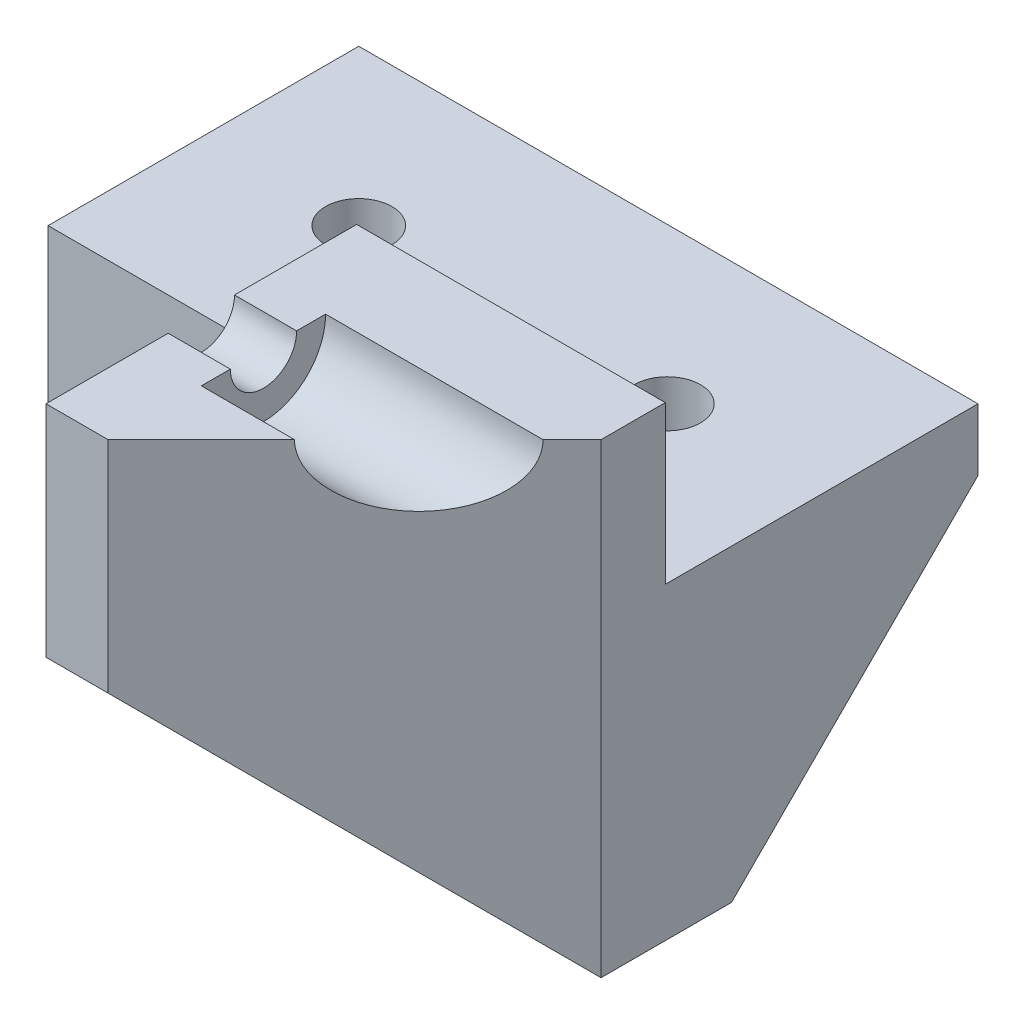
ISO-10303-21;
HEADER;
FILE_DESCRIPTION(('STEP AP214'),'2;1');
FILE_NAME('part.step','',(''),(''),'','','');
FILE_SCHEMA(('AUTOMOTIVE_DESIGN { 1 0 10303 214 1 1 1 1 }'));
ENDSEC;
DATA;
#1=APPLICATION_CONTEXT('core data for automotive mechanical design processes');
#2=APPLICATION_PROTOCOL_DEFINITION('international standard','automotive_design',2000,#1);
#3=PRODUCT_CONTEXT('',#1,'mechanical');
#4=PRODUCT('Part','Part','',(#3));
#5=PRODUCT_RELATED_PRODUCT_CATEGORY('part','',(#4));
#6=PRODUCT_DEFINITION_FORMATION('','',#4);
#7=PRODUCT_DEFINITION_CONTEXT('part definition',#1,'design');
#8=PRODUCT_DEFINITION('design','',#6,#7);
#9=PRODUCT_DEFINITION_SHAPE('','',#8);
#10=(LENGTH_UNIT() NAMED_UNIT(*) SI_UNIT(.MILLI.,.METRE.));
#11=(NAMED_UNIT(*) PLANE_ANGLE_UNIT() SI_UNIT($,.RADIAN.));
#12=(NAMED_UNIT(*) SI_UNIT($,.STERADIAN.) SOLID_ANGLE_UNIT());
#13=UNCERTAINTY_MEASURE_WITH_UNIT(LENGTH_MEASURE(1.E-05),#10,'distance_accuracy_value','');
#14=(GEOMETRIC_REPRESENTATION_CONTEXT(3) GLOBAL_UNCERTAINTY_ASSIGNED_CONTEXT((#13)) GLOBAL_UNIT_ASSIGNED_CONTEXT((#10,
#11,#12)) REPRESENTATION_CONTEXT('',''));
#15=CARTESIAN_POINT('',(0.,0.,0.));
#16=DIRECTION('',(0.,0.,1.));
#17=DIRECTION('',(1.,0.,0.));
#18=AXIS2_PLACEMENT_3D('',#15,#16,#17);
#19=CARTESIAN_POINT('',(29.8,0.,0.));
#20=DIRECTION('',(0.,1.,0.));
#21=DIRECTION('',(0.,0.,1.));
#22=AXIS2_PLACEMENT_3D('',#19,#20,#21);
#23=PLANE('',#22);
#24=DIRECTION('',(0.,0.,-1.));
#25=VECTOR('',#24,1.);
#26=CARTESIAN_POINT('',(6.,0.,0.));
#27=LINE('',#26,#25);
#28=CARTESIAN_POINT('',(6.,0.,11.8));
#29=VERTEX_POINT('',#28);
#30=CARTESIAN_POINT('',(6.,0.,9.00000000000001));
#31=VERTEX_POINT('',#30);
#32=EDGE_CURVE('E165',#29,#31,#27,.T.);
#33=ORIENTED_EDGE('',*,*,#32,.T.);
#34=DIRECTION('',(-1.,0.,0.));
#35=VECTOR('',#34,1.);
#36=CARTESIAN_POINT('',(29.8,0.,9.00000000000001));
#37=LINE('',#36,#35);
#38=CARTESIAN_POINT('',(26.9999999999999,0.,9.00000000000001));
#39=VERTEX_POINT('',#38);
#40=EDGE_CURVE('E162',#39,#31,#37,.T.);
#41=ORIENTED_EDGE('',*,*,#40,.F.);
#42=DIRECTION('',(-0.707106781186544,0.,0.707106781186552));
#43=VECTOR('',#42,1.);
#44=CARTESIAN_POINT('',(18.0000000000001,0.,17.9999999999999));
#45=LINE('',#44,#43);
#46=CARTESIAN_POINT('',(29.8,0.,6.19999999999991));
#47=VERTEX_POINT('',#46);
#48=EDGE_CURVE('E196',#47,#39,#45,.T.);
#49=ORIENTED_EDGE('',*,*,#48,.F.);
#50=DIRECTION('',(0.,0.,-1.));
#51=VECTOR('',#50,1.);
#52=CARTESIAN_POINT('',(29.8,0.,0.));
#53=LINE('',#52,#51);
#54=CARTESIAN_POINT('',(29.8,0.,0.));
#55=VERTEX_POINT('',#54);
#56=EDGE_CURVE('E227',#47,#55,#53,.T.);
#57=ORIENTED_EDGE('',*,*,#56,.T.);
#58=DIRECTION('',(-1.,0.,0.));
#59=VECTOR('',#58,1.);
#60=CARTESIAN_POINT('',(29.8,0.,0.));
#61=LINE('',#60,#59);
#62=CARTESIAN_POINT('',(0.,0.,0.));
#63=VERTEX_POINT('',#62);
#64=EDGE_CURVE('E245',#55,#63,#61,.T.);
#65=ORIENTED_EDGE('',*,*,#64,.T.);
#66=DIRECTION('',(0.,0.,-1.));
#67=VECTOR('',#66,1.);
#68=CARTESIAN_POINT('',(0.,0.,0.));
#69=LINE('',#68,#67);
#70=CARTESIAN_POINT('',(0.,0.,11.8));
#71=VERTEX_POINT('',#70);
#72=EDGE_CURVE('E225',#71,#63,#69,.T.);
#73=ORIENTED_EDGE('',*,*,#72,.F.);
#74=DIRECTION('',(-1.,0.,0.));
#75=VECTOR('',#74,1.);
#76=CARTESIAN_POINT('',(29.8,0.,11.8));
#77=LINE('',#76,#75);
#78=EDGE_CURVE('E63',#29,#71,#77,.T.);
#79=ORIENTED_EDGE('',*,*,#78,.F.);
#80=EDGE_LOOP('',(#33,#41,#49,#57,#65,#73,#79));
#81=FACE_BOUND('',#80,.T.);
#82=ADVANCED_FACE('F55',(#81),#23,.T.);
#83=CARTESIAN_POINT('',(29.8,0.,15.));
#84=DIRECTION('',(-1.,0.,0.));
#85=DIRECTION('',(0.,0.,1.));
#86=AXIS2_PLACEMENT_3D('',#83,#84,#85);
#87=CYLINDRICAL_SURFACE('',#86,3.2);
#88=DIRECTION('',(-1.,0.,0.));
#89=VECTOR('',#88,1.);
#90=CARTESIAN_POINT('',(29.8,0.,18.2));
#91=LINE('',#90,#89);
#92=CARTESIAN_POINT('',(6.,0.,18.2));
#93=VERTEX_POINT('',#92);
#94=CARTESIAN_POINT('',(0.,0.,18.2));
#95=VERTEX_POINT('',#94);
#96=EDGE_CURVE('E281',#93,#95,#91,.T.);
#97=ORIENTED_EDGE('',*,*,#96,.F.);
#98=CARTESIAN_POINT('',(6.,0.,15.));
#99=DIRECTION('',(1.,0.,0.));
#100=DIRECTION('',(0.,0.,-1.));
#101=AXIS2_PLACEMENT_3D('',#98,#99,#100);
#102=CIRCLE('',#101,3.2);
#103=EDGE_CURVE('E171',#93,#29,#102,.T.);
#104=ORIENTED_EDGE('',*,*,#103,.T.);
#105=ORIENTED_EDGE('',*,*,#78,.T.);
#106=CARTESIAN_POINT('',(0.,0.,15.));
#107=DIRECTION('',(1.,0.,0.));
#108=DIRECTION('',(0.,0.,-1.));
#109=AXIS2_PLACEMENT_3D('',#106,#107,#108);
#110=CIRCLE('',#109,3.2);
#111=EDGE_CURVE('E248',#95,#71,#110,.T.);
#112=ORIENTED_EDGE('',*,*,#111,.F.);
#113=EDGE_LOOP('',(#97,#104,#105,#112));
#114=FACE_BOUND('',#113,.T.);
#115=ADVANCED_FACE('F57',(#114),#87,.F.);
#116=CARTESIAN_POINT('',(15.0000000000001,0.,21.));
#117=VERTEX_POINT('',#116);
#118=CARTESIAN_POINT('',(6.00000000000016,0.,30.));
#119=VERTEX_POINT('',#118);
#120=EDGE_CURVE('E178',#117,#119,#45,.T.);
#121=ORIENTED_EDGE('',*,*,#120,.F.);
#122=DIRECTION('',(-1.,0.,0.));
#123=VECTOR('',#122,1.);
#124=CARTESIAN_POINT('',(29.8,0.,21.));
#125=LINE('',#124,#123);
#126=CARTESIAN_POINT('',(6.,0.,21.));
#127=VERTEX_POINT('',#126);
#128=EDGE_CURVE('E69',#117,#127,#125,.T.);
#129=ORIENTED_EDGE('',*,*,#128,.T.);
#130=EDGE_CURVE('E166',#127,#93,#27,.T.);
#131=ORIENTED_EDGE('',*,*,#130,.T.);
#132=ORIENTED_EDGE('',*,*,#96,.T.);
#133=CARTESIAN_POINT('',(0.,0.,30.));
#134=VERTEX_POINT('',#133);
#135=EDGE_CURVE('E249',#134,#95,#69,.T.);
#136=ORIENTED_EDGE('',*,*,#135,.F.);
#137=DIRECTION('',(-1.,0.,0.));
#138=VECTOR('',#137,1.);
#139=CARTESIAN_POINT('',(29.8,0.,30.));
#140=LINE('',#139,#138);
#141=EDGE_CURVE('E279',#119,#134,#140,.T.);
#142=ORIENTED_EDGE('',*,*,#141,.F.);
#143=EDGE_LOOP('',(#121,#129,#131,#132,#136,#142));
#144=FACE_BOUND('',#143,.T.);
#145=ADVANCED_FACE('F176',(#144),#23,.T.);
#146=CARTESIAN_POINT('',(18.0000000000001,-45.,17.9999999999999));
#147=DIRECTION('',(-0.707106781186551,0.,-0.707106781186543));
#148=DIRECTION('',(-0.707106781186544,0.,0.707106781186552));
#149=AXIS2_PLACEMENT_3D('',#146,#147,#148);
#150=PLANE('',#149);
#151=CARTESIAN_POINT('',(21.,0.,15.));
#152=DIRECTION('',(-0.707106781186551,0.,-0.707106781186543));
#153=DIRECTION('',(-0.707106781186544,0.,0.707106781186552));
#154=AXIS2_PLACEMENT_3D('',#151,#152,#153);
#155=ELLIPSE('',#154,8.48528137423852,6.);
#156=EDGE_CURVE('E12',#117,#39,#155,.F.);
#157=ORIENTED_EDGE('',*,*,#156,.F.);
#158=ORIENTED_EDGE('',*,*,#120,.T.);
#159=DIRECTION('',(0.,1.,0.));
#160=VECTOR('',#159,1.);
#161=CARTESIAN_POINT('',(6.00000000000016,-45.,30.));
#162=LINE('',#161,#160);
#163=CARTESIAN_POINT('',(6.00000000000016,-21.2,30.));
#164=VERTEX_POINT('',#163);
#165=EDGE_CURVE('E200',#164,#119,#162,.T.);
#166=ORIENTED_EDGE('',*,*,#165,.F.);
#167=DIRECTION('',(0.577350269189622,-0.577350269189627,-0.577350269189629));
#168=VECTOR('',#167,1.);
#169=CARTESIAN_POINT('',(16.8666666666667,-32.0666666666666,19.1333333333333));
#170=LINE('',#169,#168);
#171=CARTESIAN_POINT('',(29.8,-45.,6.19999999999991));
#172=VERTEX_POINT('',#171);
#173=EDGE_CURVE('E203',#164,#172,#170,.T.);
#174=ORIENTED_EDGE('',*,*,#173,.T.);
#175=DIRECTION('',(0.,1.,0.));
#176=VECTOR('',#175,1.);
#177=CARTESIAN_POINT('',(29.8,-45.,6.19999999999991));
#178=LINE('',#177,#176);
#179=EDGE_CURVE('E199',#172,#47,#178,.T.);
#180=ORIENTED_EDGE('',*,*,#179,.T.);
#181=ORIENTED_EDGE('',*,*,#48,.T.);
#182=EDGE_LOOP('',(#157,#158,#166,#174,#180,#181));
#183=FACE_BOUND('',#182,.T.);
#184=ADVANCED_FACE('F294',(#183),#150,.F.);
#185=CARTESIAN_POINT('',(29.8,0.,30.));
#186=DIRECTION('',(0.,0.,1.));
#187=DIRECTION('',(1.,0.,0.));
#188=AXIS2_PLACEMENT_3D('',#185,#186,#187);
#189=PLANE('',#188);
#190=ORIENTED_EDGE('',*,*,#165,.T.);
#191=ORIENTED_EDGE('',*,*,#141,.T.);
#192=DIRECTION('',(0.,1.,0.));
#193=VECTOR('',#192,1.);
#194=CARTESIAN_POINT('',(0.,0.,30.));
#195=LINE('',#194,#193);
#196=CARTESIAN_POINT('',(0.,-21.2,30.));
#197=VERTEX_POINT('',#196);
#198=EDGE_CURVE('E252',#197,#134,#195,.T.);
#199=ORIENTED_EDGE('',*,*,#198,.F.);
#200=DIRECTION('',(-1.,0.,0.));
#201=VECTOR('',#200,1.);
#202=CARTESIAN_POINT('',(29.8,-21.2,30.));
#203=LINE('',#202,#201);
#204=EDGE_CURVE('E277',#164,#197,#203,.T.);
#205=ORIENTED_EDGE('',*,*,#204,.F.);
#206=EDGE_LOOP('',(#190,#191,#199,#205));
#207=FACE_BOUND('',#206,.T.);
#208=ADVANCED_FACE('F298',(#207),#189,.T.);
#209=CARTESIAN_POINT('',(29.8,-25.6,25.5999999999999));
#210=DIRECTION('',(0.,-0.707106781186549,0.707106781186546));
#211=DIRECTION('',(0.,-0.707106781186546,-0.707106781186549));
#212=AXIS2_PLACEMENT_3D('',#209,#210,#211);
#213=PLANE('',#212);
#214=ORIENTED_EDGE('',*,*,#173,.F.);
#215=ORIENTED_EDGE('',*,*,#204,.T.);
#216=DIRECTION('',(0.,0.707106781186546,0.707106781186549));
#217=VECTOR('',#216,1.);
#218=CARTESIAN_POINT('',(0.,-25.6,25.5999999999999));
#219=LINE('',#218,#217);
#220=CARTESIAN_POINT('',(0.,-45.,6.19999999999991));
#221=VERTEX_POINT('',#220);
#222=EDGE_CURVE('E255',#221,#197,#219,.T.);
#223=ORIENTED_EDGE('',*,*,#222,.F.);
#224=DIRECTION('',(-1.,0.,0.));
#225=VECTOR('',#224,1.);
#226=CARTESIAN_POINT('',(29.8,-45.,6.19999999999991));
#227=LINE('',#226,#225);
#228=EDGE_CURVE('E274',#172,#221,#227,.T.);
#229=ORIENTED_EDGE('',*,*,#228,.F.);
#230=EDGE_LOOP('',(#214,#215,#223,#229));
#231=FACE_BOUND('',#230,.T.);
#232=ADVANCED_FACE('F309',(#231),#213,.T.);
#233=CARTESIAN_POINT('',(29.8,-45.,0.));
#234=DIRECTION('',(0.,-1.,0.));
#235=DIRECTION('',(0.,0.,-1.));
#236=AXIS2_PLACEMENT_3D('',#233,#234,#235);
#237=PLANE('',#236);
#238=DIRECTION('',(0.,0.,1.));
#239=VECTOR('',#238,1.);
#240=CARTESIAN_POINT('',(0.,-45.,0.));
#241=LINE('',#240,#239);
#242=CARTESIAN_POINT('',(0.,-45.,-0.199999999999997));
#243=VERTEX_POINT('',#242);
#244=EDGE_CURVE('E258',#243,#221,#241,.T.);
#245=ORIENTED_EDGE('',*,*,#244,.F.);
#246=DIRECTION('',(1.,0.,0.));
#247=VECTOR('',#246,1.);
#248=CARTESIAN_POINT('',(-30.,-45.,-0.199999999999997));
#249=LINE('',#248,#247);
#250=CARTESIAN_POINT('',(-30.,-45.,-0.199999999999997));
#251=VERTEX_POINT('',#250);
#252=EDGE_CURVE('E77',#251,#243,#249,.T.);
#253=ORIENTED_EDGE('',*,*,#252,.F.);
#254=DIRECTION('',(0.,0.,1.));
#255=VECTOR('',#254,1.);
#256=CARTESIAN_POINT('',(-30.,-45.,0.));
#257=LINE('',#256,#255);
#258=CARTESIAN_POINT('',(-30.,-45.,-6.39999999999993));
#259=VERTEX_POINT('',#258);
#260=EDGE_CURVE('E213',#259,#251,#257,.T.);
#261=ORIENTED_EDGE('',*,*,#260,.F.);
#262=DIRECTION('',(-1.,0.,0.));
#263=VECTOR('',#262,1.);
#264=CARTESIAN_POINT('',(29.8,-45.,-6.39999999999993));
#265=LINE('',#264,#263);
#266=CARTESIAN_POINT('',(29.8,-45.,-6.39999999999993));
#267=VERTEX_POINT('',#266);
#268=EDGE_CURVE('E272',#267,#259,#265,.T.);
#269=ORIENTED_EDGE('',*,*,#268,.F.);
#270=DIRECTION('',(0.,0.,1.));
#271=VECTOR('',#270,1.);
#272=CARTESIAN_POINT('',(29.8,-45.,0.));
#273=LINE('',#272,#271);
#274=EDGE_CURVE('E229',#267,#172,#273,.T.);
#275=ORIENTED_EDGE('',*,*,#274,.T.);
#276=ORIENTED_EDGE('',*,*,#228,.T.);
#277=EDGE_LOOP('',(#245,#253,#261,#269,#275,#276));
#278=FACE_BOUND('',#277,.T.);
#279=ADVANCED_FACE('F341',(#278),#237,.T.);
#280=CARTESIAN_POINT('',(29.8,-25.7,-25.7));
#281=DIRECTION('',(0.,-0.707106781186549,-0.707106781186547));
#282=DIRECTION('',(0.,0.707106781186546,-0.707106781186549));
#283=AXIS2_PLACEMENT_3D('',#280,#281,#282);
#284=PLANE('',#283);
#285=CARTESIAN_POINT('',(14.8,-36.2,-15.2));
#286=DIRECTION('',(0.,-0.707106781186549,-0.707106781186547));
#287=DIRECTION('',(0.,0.707106781186546,-0.707106781186549));
#288=AXIS2_PLACEMENT_3D('',#285,#286,#287);
#289=ELLIPSE('',#288,8.48528137423856,6.);
#290=CARTESIAN_POINT('',(14.8,-30.2,-21.2));
#291=VERTEX_POINT('',#290);
#292=EDGE_CURVE('E289',#291,#291,#289,.T.);
#293=ORIENTED_EDGE('',*,*,#292,.F.);
#294=EDGE_LOOP('',(#293));
#295=FACE_BOUND('',#294,.T.);
#296=CARTESIAN_POINT('',(-15.,-36.2,-15.2));
#297=DIRECTION('',(0.,-0.707106781186549,-0.707106781186547));
#298=DIRECTION('',(0.,0.707106781186546,-0.707106781186549));
#299=AXIS2_PLACEMENT_3D('',#296,#297,#298);
#300=ELLIPSE('',#299,8.48528137423856,6.);
#301=CARTESIAN_POINT('',(-15.,-30.2,-21.2));
#302=VERTEX_POINT('',#301);
#303=EDGE_CURVE('E192',#302,#302,#300,.T.);
#304=ORIENTED_EDGE('',*,*,#303,.F.);
#305=EDGE_LOOP('',(#304));
#306=FACE_BOUND('',#305,.T.);
#307=ORIENTED_EDGE('',*,*,#268,.T.);
#308=DIRECTION('',(0.,-0.707106781186546,0.707106781186549));
#309=VECTOR('',#308,1.);
#310=CARTESIAN_POINT('',(-30.,-25.7,-25.7));
#311=LINE('',#310,#309);
#312=CARTESIAN_POINT('',(-30.,-21.2,-30.2));
#313=VERTEX_POINT('',#312);
#314=EDGE_CURVE('E215',#313,#259,#311,.T.);
#315=ORIENTED_EDGE('',*,*,#314,.F.);
#316=DIRECTION('',(-1.,0.,0.));
#317=VECTOR('',#316,1.);
#318=CARTESIAN_POINT('',(29.8,-21.2,-30.2));
#319=LINE('',#318,#317);
#320=CARTESIAN_POINT('',(29.8,-21.2,-30.2));
#321=VERTEX_POINT('',#320);
#322=EDGE_CURVE('E270',#321,#313,#319,.T.);
#323=ORIENTED_EDGE('',*,*,#322,.F.);
#324=DIRECTION('',(0.,-0.707106781186546,0.707106781186549));
#325=VECTOR('',#324,1.);
#326=CARTESIAN_POINT('',(29.8,-25.7,-25.7));
#327=LINE('',#326,#325);
#328=EDGE_CURVE('E233',#321,#267,#327,.T.);
#329=ORIENTED_EDGE('',*,*,#328,.T.);
#330=EDGE_LOOP('',(#307,#315,#323,#329));
#331=FACE_BOUND('',#330,.T.);
#332=ADVANCED_FACE('F344',(#295,#306,#331),#284,.T.);
#333=CARTESIAN_POINT('',(29.8,0.,-30.2));
#334=DIRECTION('',(0.,0.,-1.));
#335=DIRECTION('',(0.,1.,0.));
#336=AXIS2_PLACEMENT_3D('',#333,#334,#335);
#337=PLANE('',#336);
#338=ORIENTED_EDGE('',*,*,#322,.T.);
#339=DIRECTION('',(0.,-1.,0.));
#340=VECTOR('',#339,1.);
#341=CARTESIAN_POINT('',(-30.,0.,-30.2));
#342=LINE('',#341,#340);
#343=CARTESIAN_POINT('',(-30.,-15.2,-30.2));
#344=VERTEX_POINT('',#343);
#345=EDGE_CURVE('E218',#344,#313,#342,.T.);
#346=ORIENTED_EDGE('',*,*,#345,.F.);
#347=DIRECTION('',(-1.,0.,0.));
#348=VECTOR('',#347,1.);
#349=CARTESIAN_POINT('',(29.8,-15.2,-30.2));
#350=LINE('',#349,#348);
#351=CARTESIAN_POINT('',(29.8,-15.2,-30.2));
#352=VERTEX_POINT('',#351);
#353=EDGE_CURVE('E268',#352,#344,#350,.T.);
#354=ORIENTED_EDGE('',*,*,#353,.F.);
#355=DIRECTION('',(0.,-1.,0.));
#356=VECTOR('',#355,1.);
#357=CARTESIAN_POINT('',(29.8,0.,-30.2));
#358=LINE('',#357,#356);
#359=EDGE_CURVE('E236',#352,#321,#358,.T.);
#360=ORIENTED_EDGE('',*,*,#359,.T.);
#361=EDGE_LOOP('',(#338,#346,#354,#360));
#362=FACE_BOUND('',#361,.T.);
#363=ADVANCED_FACE('F348',(#362),#337,.T.);
#364=CARTESIAN_POINT('',(29.8,-15.2,0.));
#365=DIRECTION('',(0.,1.,0.));
#366=DIRECTION('',(0.,0.,1.));
#367=AXIS2_PLACEMENT_3D('',#364,#365,#366);
#368=PLANE('',#367);
#369=CARTESIAN_POINT('',(14.8,-15.2,-15.2));
#370=DIRECTION('',(0.,1.,0.));
#371=DIRECTION('',(0.,0.,1.));
#372=AXIS2_PLACEMENT_3D('',#369,#370,#371);
#373=CIRCLE('',#372,3.2);
#374=CARTESIAN_POINT('',(14.8,-15.2,-12.));
#375=VERTEX_POINT('',#374);
#376=EDGE_CURVE('E223',#375,#375,#373,.T.);
#377=ORIENTED_EDGE('',*,*,#376,.F.);
#378=EDGE_LOOP('',(#377));
#379=FACE_BOUND('',#378,.T.);
#380=CARTESIAN_POINT('',(-15.,-15.2,-15.2));
#381=DIRECTION('',(0.,1.,0.));
#382=DIRECTION('',(0.,0.,1.));
#383=AXIS2_PLACEMENT_3D('',#380,#381,#382);
#384=CIRCLE('',#383,3.2);
#385=CARTESIAN_POINT('',(-15.,-15.2,-12.));
#386=VERTEX_POINT('',#385);
#387=EDGE_CURVE('E206',#386,#386,#384,.T.);
#388=ORIENTED_EDGE('',*,*,#387,.F.);
#389=EDGE_LOOP('',(#388));
#390=FACE_BOUND('',#389,.T.);
#391=DIRECTION('',(0.,0.,-1.));
#392=VECTOR('',#391,1.);
#393=CARTESIAN_POINT('',(0.,-15.2,0.));
#394=LINE('',#393,#392);
#395=CARTESIAN_POINT('',(0.,-15.2,0.));
#396=VERTEX_POINT('',#395);
#397=CARTESIAN_POINT('',(0.,-15.2,-0.199999999999997));
#398=VERTEX_POINT('',#397);
#399=EDGE_CURVE('E260',#396,#398,#394,.T.);
#400=ORIENTED_EDGE('',*,*,#399,.F.);
#401=DIRECTION('',(-1.,0.,0.));
#402=VECTOR('',#401,1.);
#403=CARTESIAN_POINT('',(29.8,-15.2,0.));
#404=LINE('',#403,#402);
#405=CARTESIAN_POINT('',(29.8,-15.2,0.));
#406=VERTEX_POINT('',#405);
#407=EDGE_CURVE('E266',#406,#396,#404,.T.);
#408=ORIENTED_EDGE('',*,*,#407,.F.);
#409=DIRECTION('',(0.,0.,-1.));
#410=VECTOR('',#409,1.);
#411=CARTESIAN_POINT('',(29.8,-15.2,0.));
#412=LINE('',#411,#410);
#413=EDGE_CURVE('E239',#406,#352,#412,.T.);
#414=ORIENTED_EDGE('',*,*,#413,.T.);
#415=ORIENTED_EDGE('',*,*,#353,.T.);
#416=DIRECTION('',(0.,0.,-1.));
#417=VECTOR('',#416,1.);
#418=CARTESIAN_POINT('',(-30.,-15.2,0.));
#419=LINE('',#418,#417);
#420=CARTESIAN_POINT('',(-30.,-15.2,-0.199999999999997));
#421=VERTEX_POINT('',#420);
#422=EDGE_CURVE('E207',#421,#344,#419,.T.);
#423=ORIENTED_EDGE('',*,*,#422,.F.);
#424=DIRECTION('',(1.,0.,0.));
#425=VECTOR('',#424,1.);
#426=CARTESIAN_POINT('',(-30.,-15.2,-0.199999999999997));
#427=LINE('',#426,#425);
#428=EDGE_CURVE('E221',#421,#398,#427,.T.);
#429=ORIENTED_EDGE('',*,*,#428,.T.);
#430=EDGE_LOOP('',(#400,#408,#414,#415,#423,#429));
#431=FACE_BOUND('',#430,.T.);
#432=ADVANCED_FACE('F352',(#379,#390,#431),#368,.T.);
#433=CARTESIAN_POINT('',(29.8,0.,0.));
#434=DIRECTION('',(0.,0.,-1.));
#435=DIRECTION('',(0.,1.,0.));
#436=AXIS2_PLACEMENT_3D('',#433,#434,#435);
#437=PLANE('',#436);
#438=DIRECTION('',(0.,-1.,0.));
#439=VECTOR('',#438,1.);
#440=CARTESIAN_POINT('',(0.,0.,0.));
#441=LINE('',#440,#439);
#442=EDGE_CURVE('E230',#63,#396,#441,.T.);
#443=ORIENTED_EDGE('',*,*,#442,.F.);
#444=ORIENTED_EDGE('',*,*,#64,.F.);
#445=DIRECTION('',(0.,-1.,0.));
#446=VECTOR('',#445,1.);
#447=CARTESIAN_POINT('',(29.8,0.,0.));
#448=LINE('',#447,#446);
#449=EDGE_CURVE('E242',#55,#406,#448,.T.);
#450=ORIENTED_EDGE('',*,*,#449,.T.);
#451=ORIENTED_EDGE('',*,*,#407,.T.);
#452=EDGE_LOOP('',(#443,#444,#450,#451));
#453=FACE_BOUND('',#452,.T.);
#454=ADVANCED_FACE('F324',(#453),#437,.T.);
#455=CARTESIAN_POINT('',(29.8,0.,0.));
#456=DIRECTION('',(1.,0.,0.));
#457=DIRECTION('',(0.,0.,-1.));
#458=AXIS2_PLACEMENT_3D('',#455,#456,#457);
#459=PLANE('',#458);
#460=ORIENTED_EDGE('',*,*,#179,.F.);
#461=ORIENTED_EDGE('',*,*,#274,.F.);
#462=ORIENTED_EDGE('',*,*,#328,.F.);
#463=ORIENTED_EDGE('',*,*,#359,.F.);
#464=ORIENTED_EDGE('',*,*,#413,.F.);
#465=ORIENTED_EDGE('',*,*,#449,.F.);
#466=ORIENTED_EDGE('',*,*,#56,.F.);
#467=EDGE_LOOP('',(#460,#461,#462,#463,#464,#465,#466));
#468=FACE_BOUND('',#467,.T.);
#469=ADVANCED_FACE('F315',(#468),#459,.T.);
#470=CARTESIAN_POINT('',(0.,0.,0.));
#471=DIRECTION('',(1.,0.,0.));
#472=DIRECTION('',(0.,0.,-1.));
#473=AXIS2_PLACEMENT_3D('',#470,#471,#472);
#474=PLANE('',#473);
#475=ORIENTED_EDGE('',*,*,#399,.T.);
#476=DIRECTION('',(0.,-1.,0.));
#477=VECTOR('',#476,1.);
#478=CARTESIAN_POINT('',(0.,0.,-0.199999999999993));
#479=LINE('',#478,#477);
#480=EDGE_CURVE('E211',#398,#243,#479,.T.);
#481=ORIENTED_EDGE('',*,*,#480,.T.);
#482=ORIENTED_EDGE('',*,*,#244,.T.);
#483=ORIENTED_EDGE('',*,*,#222,.T.);
#484=ORIENTED_EDGE('',*,*,#198,.T.);
#485=ORIENTED_EDGE('',*,*,#135,.T.);
#486=ORIENTED_EDGE('',*,*,#111,.T.);
#487=ORIENTED_EDGE('',*,*,#72,.T.);
#488=ORIENTED_EDGE('',*,*,#442,.T.);
#489=EDGE_LOOP('',(#475,#481,#482,#483,#484,#485,#486,#487,#488));
#490=FACE_BOUND('',#489,.T.);
#491=ADVANCED_FACE('F304',(#490),#474,.F.);
#492=CARTESIAN_POINT('',(-30.,0.,-0.199999999999993));
#493=DIRECTION('',(0.,0.,1.));
#494=DIRECTION('',(0.,-1.,0.));
#495=AXIS2_PLACEMENT_3D('',#492,#493,#494);
#496=PLANE('',#495);
#497=ORIENTED_EDGE('',*,*,#480,.F.);
#498=ORIENTED_EDGE('',*,*,#428,.F.);
#499=DIRECTION('',(0.,-1.,0.));
#500=VECTOR('',#499,1.);
#501=CARTESIAN_POINT('',(-30.,0.,-0.199999999999993));
#502=LINE('',#501,#500);
#503=EDGE_CURVE('E210',#421,#251,#502,.T.);
#504=ORIENTED_EDGE('',*,*,#503,.T.);
#505=ORIENTED_EDGE('',*,*,#252,.T.);
#506=EDGE_LOOP('',(#497,#498,#504,#505));
#507=FACE_BOUND('',#506,.T.);
#508=ADVANCED_FACE('F361',(#507),#496,.T.);
#509=CARTESIAN_POINT('',(-30.,0.,0.));
#510=DIRECTION('',(1.,0.,0.));
#511=DIRECTION('',(0.,0.,-1.));
#512=AXIS2_PLACEMENT_3D('',#509,#510,#511);
#513=PLANE('',#512);
#514=ORIENTED_EDGE('',*,*,#422,.T.);
#515=ORIENTED_EDGE('',*,*,#345,.T.);
#516=ORIENTED_EDGE('',*,*,#314,.T.);
#517=ORIENTED_EDGE('',*,*,#260,.T.);
#518=ORIENTED_EDGE('',*,*,#503,.F.);
#519=EDGE_LOOP('',(#514,#515,#516,#517,#518));
#520=FACE_BOUND('',#519,.T.);
#521=ADVANCED_FACE('F366',(#520),#513,.F.);
#522=CARTESIAN_POINT('',(-15.,-45.,-15.2));
#523=DIRECTION('',(0.,1.,0.));
#524=DIRECTION('',(0.,0.,1.));
#525=AXIS2_PLACEMENT_3D('',#522,#523,#524);
#526=CYLINDRICAL_SURFACE('',#525,3.2);
#527=CARTESIAN_POINT('',(-15.,-21.2,-15.2));
#528=DIRECTION('',(0.,1.,0.));
#529=DIRECTION('',(0.,0.,1.));
#530=AXIS2_PLACEMENT_3D('',#527,#528,#529);
#531=CIRCLE('',#530,3.2);
#532=CARTESIAN_POINT('',(-15.,-21.2,-12.));
#533=VERTEX_POINT('',#532);
#534=EDGE_CURVE('E179',#533,#533,#531,.T.);
#535=CARTESIAN_POINT('',(-15.,-21.2,-12.));
#536=CARTESIAN_POINT('',(-15.,-21.1375,-12.));
#537=CARTESIAN_POINT('',(-15.,-21.075,-12.));
#538=CARTESIAN_POINT('',(-15.,-20.95,-12.));
#539=CARTESIAN_POINT('',(-15.,-20.8875,-12.));
#540=CARTESIAN_POINT('',(-15.,-20.7625,-12.));
#541=CARTESIAN_POINT('',(-15.,-20.7,-12.));
#542=CARTESIAN_POINT('',(-15.,-20.575,-12.));
#543=CARTESIAN_POINT('',(-15.,-20.5125,-12.));
#544=CARTESIAN_POINT('',(-15.,-20.3875,-12.));
#545=CARTESIAN_POINT('',(-15.,-20.325,-12.));
#546=CARTESIAN_POINT('',(-15.,-20.2,-12.));
#547=CARTESIAN_POINT('',(-15.,-20.1375,-12.));
#548=CARTESIAN_POINT('',(-15.,-20.0125,-12.));
#549=CARTESIAN_POINT('',(-15.,-19.95,-12.));
#550=CARTESIAN_POINT('',(-15.,-19.825,-12.));
#551=CARTESIAN_POINT('',(-15.,-19.7625,-12.));
#552=CARTESIAN_POINT('',(-15.,-19.6375,-12.));
#553=CARTESIAN_POINT('',(-15.,-19.575,-12.));
#554=CARTESIAN_POINT('',(-15.,-19.45,-12.));
#555=CARTESIAN_POINT('',(-15.,-19.3875,-12.));
#556=CARTESIAN_POINT('',(-15.,-19.2625,-12.));
#557=CARTESIAN_POINT('',(-15.,-19.2,-12.));
#558=CARTESIAN_POINT('',(-15.,-19.075,-12.));
#559=CARTESIAN_POINT('',(-15.,-19.0125,-12.));
#560=CARTESIAN_POINT('',(-15.,-18.8875,-12.));
#561=CARTESIAN_POINT('',(-15.,-18.825,-12.));
#562=CARTESIAN_POINT('',(-15.,-18.7,-12.));
#563=CARTESIAN_POINT('',(-15.,-18.6375,-12.));
#564=CARTESIAN_POINT('',(-15.,-18.5125,-12.));
#565=CARTESIAN_POINT('',(-15.,-18.45,-12.));
#566=CARTESIAN_POINT('',(-15.,-18.325,-12.));
#567=CARTESIAN_POINT('',(-15.,-18.2625,-12.));
#568=CARTESIAN_POINT('',(-15.,-18.1375,-12.));
#569=CARTESIAN_POINT('',(-15.,-18.075,-12.));
#570=CARTESIAN_POINT('',(-15.,-17.95,-12.));
#571=CARTESIAN_POINT('',(-15.,-17.8875,-12.));
#572=CARTESIAN_POINT('',(-15.,-17.7625,-12.));
#573=CARTESIAN_POINT('',(-15.,-17.7,-12.));
#574=CARTESIAN_POINT('',(-15.,-17.575,-12.));
#575=CARTESIAN_POINT('',(-15.,-17.5125,-12.));
#576=CARTESIAN_POINT('',(-15.,-17.3875,-12.));
#577=CARTESIAN_POINT('',(-15.,-17.325,-12.));
#578=CARTESIAN_POINT('',(-15.,-17.2,-12.));
#579=CARTESIAN_POINT('',(-15.,-17.1375,-12.));
#580=CARTESIAN_POINT('',(-15.,-17.0125,-12.));
#581=CARTESIAN_POINT('',(-15.,-16.95,-12.));
#582=CARTESIAN_POINT('',(-15.,-16.825,-12.));
#583=CARTESIAN_POINT('',(-15.,-16.7625,-12.));
#584=CARTESIAN_POINT('',(-15.,-16.6375,-12.));
#585=CARTESIAN_POINT('',(-15.,-16.575,-12.));
#586=CARTESIAN_POINT('',(-15.,-16.45,-12.));
#587=CARTESIAN_POINT('',(-15.,-16.3875,-12.));
#588=CARTESIAN_POINT('',(-15.,-16.2625,-12.));
#589=CARTESIAN_POINT('',(-15.,-16.2,-12.));
#590=CARTESIAN_POINT('',(-15.,-16.075,-12.));
#591=CARTESIAN_POINT('',(-15.,-16.0125,-12.));
#592=CARTESIAN_POINT('',(-15.,-15.8875,-12.));
#593=CARTESIAN_POINT('',(-15.,-15.825,-12.));
#594=CARTESIAN_POINT('',(-15.,-15.7,-12.));
#595=CARTESIAN_POINT('',(-15.,-15.6375,-12.));
#596=CARTESIAN_POINT('',(-15.,-15.5125,-12.));
#597=CARTESIAN_POINT('',(-15.,-15.45,-12.));
#598=CARTESIAN_POINT('',(-15.,-15.325,-12.));
#599=CARTESIAN_POINT('',(-15.,-15.2625,-12.));
#600=CARTESIAN_POINT('',(-15.,-15.2,-12.));
#601=B_SPLINE_CURVE_WITH_KNOTS('',3,(#535,#536,#537,#538,#539,#540,#541,#542,#543,#544,#545,
#546,#547,#548,#549,#550,#551,#552,#553,#554,#555,#556,#557,#558,#559,#560,#561,#562,#563,#564,
#565,#566,#567,#568,#569,#570,#571,#572,#573,#574,#575,#576,#577,#578,#579,#580,#581,#582,#583,
#584,#585,#586,#587,#588,#589,#590,#591,#592,#593,#594,#595,#596,#597,#598,#599,#600),
.UNSPECIFIED.,.F.,.F.,(4,2,2,2,2,2,2,2,2,2,2,2,2,2,2,2,2,2,2,2,2,2,2,2,2,2,2,2,2,2,2,2,4),(0.,
0.1875,0.375,0.5625,0.750000000000001,0.937500000000001,1.125,1.3125,1.5,1.6875,1.875,2.0625,
2.25,2.4375,2.625,2.8125,3.,3.1875,3.375,3.5625,3.75,3.9375,4.125,4.3125,4.5,4.6875,4.875,
5.0625,5.25,5.4375,5.62500000000001,5.81250000000001,6.00000000000001),.UNSPECIFIED.);
#602=EDGE_CURVE('BSEAM369',#533,#386,#601,.T.);
#603=ORIENTED_EDGE('',*,*,#534,.F.);
#604=ORIENTED_EDGE('',*,*,#387,.T.);
#605=ORIENTED_EDGE('',*,*,#602,.T.);
#606=ORIENTED_EDGE('',*,*,#602,.F.);
#607=EDGE_LOOP('',(#603,#605,#604,#606));
#608=FACE_BOUND('',#607,.T.);
#609=ADVANCED_FACE('F369',(#608),#526,.F.);
#610=CARTESIAN_POINT('',(14.8,-45.,-15.2));
#611=DIRECTION('',(0.,1.,0.));
#612=DIRECTION('',(0.,0.,1.));
#613=AXIS2_PLACEMENT_3D('',#610,#611,#612);
#614=CYLINDRICAL_SURFACE('',#613,3.2);
#615=CARTESIAN_POINT('',(14.8,-21.2,-15.2));
#616=DIRECTION('',(0.,1.,0.));
#617=DIRECTION('',(0.,0.,1.));
#618=AXIS2_PLACEMENT_3D('',#615,#616,#617);
#619=CIRCLE('',#618,3.2);
#620=CARTESIAN_POINT('',(14.8,-21.2,-12.));
#621=VERTEX_POINT('',#620);
#622=EDGE_CURVE('E187',#621,#621,#619,.T.);
#623=CARTESIAN_POINT('',(14.8,-21.2,-12.));
#624=CARTESIAN_POINT('',(14.8,-21.1375,-12.));
#625=CARTESIAN_POINT('',(14.8,-21.075,-12.));
#626=CARTESIAN_POINT('',(14.8,-20.95,-12.));
#627=CARTESIAN_POINT('',(14.8,-20.8875,-12.));
#628=CARTESIAN_POINT('',(14.8,-20.7625,-12.));
#629=CARTESIAN_POINT('',(14.8,-20.7,-12.));
#630=CARTESIAN_POINT('',(14.8,-20.575,-12.));
#631=CARTESIAN_POINT('',(14.8,-20.5125,-12.));
#632=CARTESIAN_POINT('',(14.8,-20.3875,-12.));
#633=CARTESIAN_POINT('',(14.8,-20.325,-12.));
#634=CARTESIAN_POINT('',(14.8,-20.2,-12.));
#635=CARTESIAN_POINT('',(14.8,-20.1375,-12.));
#636=CARTESIAN_POINT('',(14.8,-20.0125,-12.));
#637=CARTESIAN_POINT('',(14.8,-19.95,-12.));
#638=CARTESIAN_POINT('',(14.8,-19.825,-12.));
#639=CARTESIAN_POINT('',(14.8,-19.7625,-12.));
#640=CARTESIAN_POINT('',(14.8,-19.6375,-12.));
#641=CARTESIAN_POINT('',(14.8,-19.575,-12.));
#642=CARTESIAN_POINT('',(14.8,-19.45,-12.));
#643=CARTESIAN_POINT('',(14.8,-19.3875,-12.));
#644=CARTESIAN_POINT('',(14.8,-19.2625,-12.));
#645=CARTESIAN_POINT('',(14.8,-19.2,-12.));
#646=CARTESIAN_POINT('',(14.8,-19.075,-12.));
#647=CARTESIAN_POINT('',(14.8,-19.0125,-12.));
#648=CARTESIAN_POINT('',(14.8,-18.8875,-12.));
#649=CARTESIAN_POINT('',(14.8,-18.825,-12.));
#650=CARTESIAN_POINT('',(14.8,-18.7,-12.));
#651=CARTESIAN_POINT('',(14.8,-18.6375,-12.));
#652=CARTESIAN_POINT('',(14.8,-18.5125,-12.));
#653=CARTESIAN_POINT('',(14.8,-18.45,-12.));
#654=CARTESIAN_POINT('',(14.8,-18.325,-12.));
#655=CARTESIAN_POINT('',(14.8,-18.2625,-12.));
#656=CARTESIAN_POINT('',(14.8,-18.1375,-12.));
#657=CARTESIAN_POINT('',(14.8,-18.075,-12.));
#658=CARTESIAN_POINT('',(14.8,-17.95,-12.));
#659=CARTESIAN_POINT('',(14.8,-17.8875,-12.));
#660=CARTESIAN_POINT('',(14.8,-17.7625,-12.));
#661=CARTESIAN_POINT('',(14.8,-17.7,-12.));
#662=CARTESIAN_POINT('',(14.8,-17.575,-12.));
#663=CARTESIAN_POINT('',(14.8,-17.5125,-12.));
#664=CARTESIAN_POINT('',(14.8,-17.3875,-12.));
#665=CARTESIAN_POINT('',(14.8,-17.325,-12.));
#666=CARTESIAN_POINT('',(14.8,-17.2,-12.));
#667=CARTESIAN_POINT('',(14.8,-17.1375,-12.));
#668=CARTESIAN_POINT('',(14.8,-17.0125,-12.));
#669=CARTESIAN_POINT('',(14.8,-16.95,-12.));
#670=CARTESIAN_POINT('',(14.8,-16.825,-12.));
#671=CARTESIAN_POINT('',(14.8,-16.7625,-12.));
#672=CARTESIAN_POINT('',(14.8,-16.6375,-12.));
#673=CARTESIAN_POINT('',(14.8,-16.575,-12.));
#674=CARTESIAN_POINT('',(14.8,-16.45,-12.));
#675=CARTESIAN_POINT('',(14.8,-16.3875,-12.));
#676=CARTESIAN_POINT('',(14.8,-16.2625,-12.));
#677=CARTESIAN_POINT('',(14.8,-16.2,-12.));
#678=CARTESIAN_POINT('',(14.8,-16.075,-12.));
#679=CARTESIAN_POINT('',(14.8,-16.0125,-12.));
#680=CARTESIAN_POINT('',(14.8,-15.8875,-12.));
#681=CARTESIAN_POINT('',(14.8,-15.825,-12.));
#682=CARTESIAN_POINT('',(14.8,-15.7,-12.));
#683=CARTESIAN_POINT('',(14.8,-15.6375,-12.));
#684=CARTESIAN_POINT('',(14.8,-15.5125,-12.));
#685=CARTESIAN_POINT('',(14.8,-15.45,-12.));
#686=CARTESIAN_POINT('',(14.8,-15.325,-12.));
#687=CARTESIAN_POINT('',(14.8,-15.2625,-12.));
#688=CARTESIAN_POINT('',(14.8,-15.2,-12.));
#689=B_SPLINE_CURVE_WITH_KNOTS('',3,(#623,#624,#625,#626,#627,#628,#629,#630,#631,#632,#633,
#634,#635,#636,#637,#638,#639,#640,#641,#642,#643,#644,#645,#646,#647,#648,#649,#650,#651,#652,
#653,#654,#655,#656,#657,#658,#659,#660,#661,#662,#663,#664,#665,#666,#667,#668,#669,#670,#671,
#672,#673,#674,#675,#676,#677,#678,#679,#680,#681,#682,#683,#684,#685,#686,#687,#688),
.UNSPECIFIED.,.F.,.F.,(4,2,2,2,2,2,2,2,2,2,2,2,2,2,2,2,2,2,2,2,2,2,2,2,2,2,2,2,2,2,2,2,4),(0.,
0.1875,0.375,0.5625,0.750000000000001,0.937500000000001,1.125,1.3125,1.5,1.6875,1.875,2.0625,
2.25,2.4375,2.625,2.8125,3.,3.1875,3.375,3.5625,3.75,3.9375,4.125,4.3125,4.5,4.6875,4.875,
5.0625,5.25,5.4375,5.62500000000001,5.81250000000001,6.00000000000001),.UNSPECIFIED.);
#690=EDGE_CURVE('BSEAM373',#621,#375,#689,.T.);
#691=ORIENTED_EDGE('',*,*,#622,.F.);
#692=ORIENTED_EDGE('',*,*,#376,.T.);
#693=ORIENTED_EDGE('',*,*,#690,.T.);
#694=ORIENTED_EDGE('',*,*,#690,.F.);
#695=EDGE_LOOP('',(#691,#693,#692,#694));
#696=FACE_BOUND('',#695,.T.);
#697=ADVANCED_FACE('F373',(#696),#614,.F.);
#698=CARTESIAN_POINT('',(14.8,-45.,-15.2));
#699=DIRECTION('',(0.,1.,0.));
#700=DIRECTION('',(0.,0.,1.));
#701=AXIS2_PLACEMENT_3D('',#698,#699,#700);
#702=CYLINDRICAL_SURFACE('',#701,6.);
#703=ORIENTED_EDGE('',*,*,#292,.T.);
#704=EDGE_LOOP('',(#703));
#705=FACE_BOUND('',#704,.T.);
#706=CARTESIAN_POINT('',(14.8,-21.2,-15.2));
#707=DIRECTION('',(0.,1.,0.));
#708=DIRECTION('',(0.,0.,1.));
#709=AXIS2_PLACEMENT_3D('',#706,#707,#708);
#710=CIRCLE('',#709,6.);
#711=CARTESIAN_POINT('',(14.8,-21.2,-9.2));
#712=VERTEX_POINT('',#711);
#713=EDGE_CURVE('E190',#712,#712,#710,.T.);
#714=ORIENTED_EDGE('',*,*,#713,.T.);
#715=EDGE_LOOP('',(#714));
#716=FACE_BOUND('',#715,.T.);
#717=ADVANCED_FACE('F377',(#705,#716),#702,.F.);
#718=CARTESIAN_POINT('',(14.8,-21.2,-15.2));
#719=DIRECTION('',(0.,1.,0.));
#720=DIRECTION('',(0.,0.,1.));
#721=AXIS2_PLACEMENT_3D('',#718,#719,#720);
#722=PLANE('',#721);
#723=ORIENTED_EDGE('',*,*,#622,.T.);
#724=EDGE_LOOP('',(#723));
#725=FACE_BOUND('',#724,.T.);
#726=ORIENTED_EDGE('',*,*,#713,.F.);
#727=EDGE_LOOP('',(#726));
#728=FACE_BOUND('',#727,.T.);
#729=ADVANCED_FACE('F385',(#725,#728),#722,.F.);
#730=CARTESIAN_POINT('',(-15.,-45.,-15.2));
#731=DIRECTION('',(0.,1.,0.));
#732=DIRECTION('',(0.,0.,1.));
#733=AXIS2_PLACEMENT_3D('',#730,#731,#732);
#734=CYLINDRICAL_SURFACE('',#733,6.);
#735=ORIENTED_EDGE('',*,*,#303,.T.);
#736=EDGE_LOOP('',(#735));
#737=FACE_BOUND('',#736,.T.);
#738=CARTESIAN_POINT('',(-15.,-21.2,-15.2));
#739=DIRECTION('',(0.,1.,0.));
#740=DIRECTION('',(0.,0.,1.));
#741=AXIS2_PLACEMENT_3D('',#738,#739,#740);
#742=CIRCLE('',#741,6.);
#743=CARTESIAN_POINT('',(-15.,-21.2,-9.2));
#744=VERTEX_POINT('',#743);
#745=EDGE_CURVE('E182',#744,#744,#742,.T.);
#746=ORIENTED_EDGE('',*,*,#745,.T.);
#747=EDGE_LOOP('',(#746));
#748=FACE_BOUND('',#747,.T.);
#749=ADVANCED_FACE('F381',(#737,#748),#734,.F.);
#750=CARTESIAN_POINT('',(-15.,-21.2,-15.2));
#751=DIRECTION('',(0.,1.,0.));
#752=DIRECTION('',(0.,0.,1.));
#753=AXIS2_PLACEMENT_3D('',#750,#751,#752);
#754=PLANE('',#753);
#755=ORIENTED_EDGE('',*,*,#534,.T.);
#756=EDGE_LOOP('',(#755));
#757=FACE_BOUND('',#756,.T.);
#758=ORIENTED_EDGE('',*,*,#745,.F.);
#759=EDGE_LOOP('',(#758));
#760=FACE_BOUND('',#759,.T.);
#761=ADVANCED_FACE('F384',(#757,#760),#754,.F.);
#762=CARTESIAN_POINT('',(29.8,0.,15.));
#763=DIRECTION('',(-1.,0.,0.));
#764=DIRECTION('',(0.,0.,1.));
#765=AXIS2_PLACEMENT_3D('',#762,#763,#764);
#766=CYLINDRICAL_SURFACE('',#765,6.);
#767=ORIENTED_EDGE('',*,*,#156,.T.);
#768=ORIENTED_EDGE('',*,*,#40,.T.);
#769=CARTESIAN_POINT('',(6.,0.,15.));
#770=DIRECTION('',(1.,0.,0.));
#771=DIRECTION('',(0.,0.,-1.));
#772=AXIS2_PLACEMENT_3D('',#769,#770,#771);
#773=CIRCLE('',#772,6.);
#774=EDGE_CURVE('E158',#127,#31,#773,.T.);
#775=ORIENTED_EDGE('',*,*,#774,.F.);
#776=ORIENTED_EDGE('',*,*,#128,.F.);
#777=EDGE_LOOP('',(#767,#768,#775,#776));
#778=FACE_BOUND('',#777,.T.);
#779=ADVANCED_FACE('F160',(#778),#766,.F.);
#780=CARTESIAN_POINT('',(6.,0.,0.));
#781=DIRECTION('',(1.,0.,0.));
#782=DIRECTION('',(0.,0.,-1.));
#783=AXIS2_PLACEMENT_3D('',#780,#781,#782);
#784=PLANE('',#783);
#785=ORIENTED_EDGE('',*,*,#130,.F.);
#786=ORIENTED_EDGE('',*,*,#774,.T.);
#787=ORIENTED_EDGE('',*,*,#32,.F.);
#788=ORIENTED_EDGE('',*,*,#103,.F.);
#789=EDGE_LOOP('',(#785,#786,#787,#788));
#790=FACE_BOUND('',#789,.T.);
#791=ADVANCED_FACE('F169',(#790),#784,.T.);
#792=CLOSED_SHELL('',(#82,#115,#145,#184,#208,#232,#279,#332,#363,#432,#454,#469,#491,#508,#521,
#609,#697,#717,#729,#749,#761,#779,#791));
#793=MANIFOLD_SOLID_BREP('B2',#792);
#794=ADVANCED_BREP_SHAPE_REPRESENTATION('',(#18,#793),#14);
#795=SHAPE_DEFINITION_REPRESENTATION(#9,#794);
ENDSEC;
END-ISO-10303-21;
